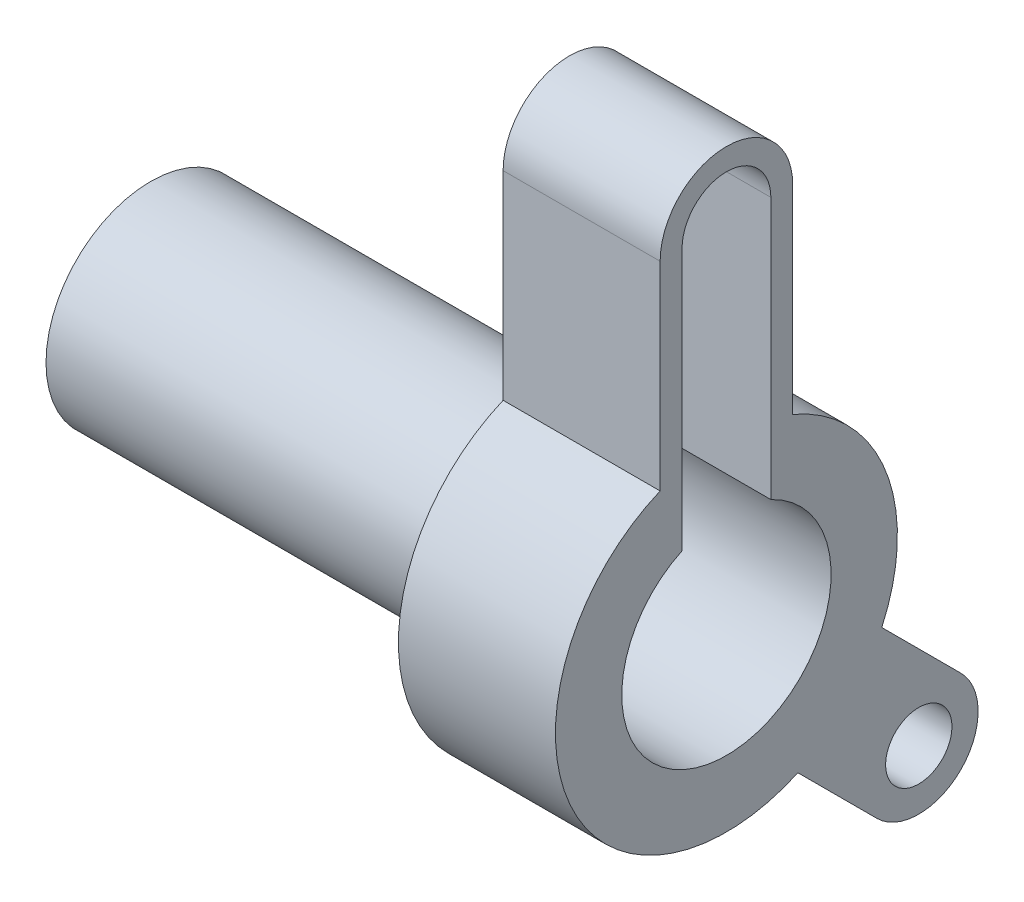
ISO-10303-21;
HEADER;
FILE_DESCRIPTION(('STEP AP214'),'2;1');
FILE_NAME('part.step','',(''),(''),'','','');
FILE_SCHEMA(('AUTOMOTIVE_DESIGN { 1 0 10303 214 1 1 1 1 }'));
ENDSEC;
DATA;
#1=APPLICATION_CONTEXT('core data for automotive mechanical design processes');
#2=APPLICATION_PROTOCOL_DEFINITION('international standard','automotive_design',2000,#1);
#3=PRODUCT_CONTEXT('',#1,'mechanical');
#4=PRODUCT('Part','Part','',(#3));
#5=PRODUCT_RELATED_PRODUCT_CATEGORY('part','',(#4));
#6=PRODUCT_DEFINITION_FORMATION('','',#4);
#7=PRODUCT_DEFINITION_CONTEXT('part definition',#1,'design');
#8=PRODUCT_DEFINITION('design','',#6,#7);
#9=PRODUCT_DEFINITION_SHAPE('','',#8);
#10=(LENGTH_UNIT() NAMED_UNIT(*) SI_UNIT(.MILLI.,.METRE.));
#11=(NAMED_UNIT(*) PLANE_ANGLE_UNIT() SI_UNIT($,.RADIAN.));
#12=(NAMED_UNIT(*) SI_UNIT($,.STERADIAN.) SOLID_ANGLE_UNIT());
#13=UNCERTAINTY_MEASURE_WITH_UNIT(LENGTH_MEASURE(1.E-05),#10,'distance_accuracy_value','');
#14=(GEOMETRIC_REPRESENTATION_CONTEXT(3) GLOBAL_UNCERTAINTY_ASSIGNED_CONTEXT((#13)) GLOBAL_UNIT_ASSIGNED_CONTEXT((#10,
#11,#12)) REPRESENTATION_CONTEXT('',''));
#15=CARTESIAN_POINT('',(0.,0.,0.));
#16=DIRECTION('',(0.,0.,1.));
#17=DIRECTION('',(1.,0.,0.));
#18=AXIS2_PLACEMENT_3D('',#15,#16,#17);
#19=CARTESIAN_POINT('',(0.,0.,0.));
#20=DIRECTION('',(-1.,0.,0.));
#21=DIRECTION('',(0.,0.,1.));
#22=AXIS2_PLACEMENT_3D('',#19,#20,#21);
#23=CYLINDRICAL_SURFACE('',#22,49.);
#24=CARTESIAN_POINT('',(120.,0.,0.));
#25=DIRECTION('',(-1.,0.,0.));
#26=DIRECTION('',(0.,0.,1.));
#27=AXIS2_PLACEMENT_3D('',#24,#25,#26);
#28=CIRCLE('',#27,49.);
#29=CARTESIAN_POINT('',(120.,-44.5169688987151,-20.4753383383727));
#30=VERTEX_POINT('',#29);
#31=CARTESIAN_POINT('',(120.,45.1663591625449,19.));
#32=VERTEX_POINT('',#31);
#33=EDGE_CURVE('E229',#30,#32,#28,.T.);
#34=ORIENTED_EDGE('',*,*,#33,.F.);
#35=DIRECTION('',(1.,0.,0.));
#36=VECTOR('',#35,1.);
#37=CARTESIAN_POINT('',(35.029416855008,-44.5169688987151,-20.4753383383727));
#38=LINE('',#37,#36);
#39=CARTESIAN_POINT('',(165.,-44.5169688987151,-20.4753383383727));
#40=VERTEX_POINT('',#39);
#41=EDGE_CURVE('E169',#30,#40,#38,.T.);
#42=ORIENTED_EDGE('',*,*,#41,.T.);
#43=CARTESIAN_POINT('',(165.,0.,0.));
#44=DIRECTION('',(-1.,0.,0.));
#45=DIRECTION('',(0.,0.,1.));
#46=AXIS2_PLACEMENT_3D('',#43,#44,#45);
#47=CIRCLE('',#46,49.);
#48=CARTESIAN_POINT('',(165.,45.1663591625449,19.));
#49=VERTEX_POINT('',#48);
#50=EDGE_CURVE('E206',#40,#49,#47,.T.);
#51=ORIENTED_EDGE('',*,*,#50,.T.);
#52=DIRECTION('',(1.,0.,0.));
#53=VECTOR('',#52,1.);
#54=CARTESIAN_POINT('',(35.029416855008,45.1663591625449,19.));
#55=LINE('',#54,#53);
#56=EDGE_CURVE('E142',#32,#49,#55,.T.);
#57=ORIENTED_EDGE('',*,*,#56,.F.);
#58=EDGE_LOOP('',(#34,#42,#51,#57));
#59=FACE_BOUND('',#58,.T.);
#60=ADVANCED_FACE('F43',(#59),#23,.T.);
#61=CARTESIAN_POINT('',(165.,45.1663591625449,-19.));
#62=VERTEX_POINT('',#61);
#63=CARTESIAN_POINT('',(165.,-20.4753383383724,-44.5169688987152));
#64=VERTEX_POINT('',#63);
#65=EDGE_CURVE('E226',#62,#64,#47,.T.);
#66=ORIENTED_EDGE('',*,*,#65,.T.);
#67=DIRECTION('',(1.,0.,0.));
#68=VECTOR('',#67,1.);
#69=CARTESIAN_POINT('',(35.029416855008,-20.4753383383724,-44.5169688987152));
#70=LINE('',#69,#68);
#71=CARTESIAN_POINT('',(120.,-20.4753383383724,-44.5169688987152));
#72=VERTEX_POINT('',#71);
#73=EDGE_CURVE('E175',#72,#64,#70,.T.);
#74=ORIENTED_EDGE('',*,*,#73,.F.);
#75=CARTESIAN_POINT('',(120.,45.1663591625449,-19.));
#76=VERTEX_POINT('',#75);
#77=EDGE_CURVE('E230',#76,#72,#28,.T.);
#78=ORIENTED_EDGE('',*,*,#77,.F.);
#79=DIRECTION('',(1.,0.,0.));
#80=VECTOR('',#79,1.);
#81=CARTESIAN_POINT('',(35.029416855008,45.1663591625449,-19.));
#82=LINE('',#81,#80);
#83=EDGE_CURVE('E158',#76,#62,#82,.T.);
#84=ORIENTED_EDGE('',*,*,#83,.T.);
#85=EDGE_LOOP('',(#66,#74,#78,#84));
#86=FACE_BOUND('',#85,.T.);
#87=ADVANCED_FACE('F256',(#86),#23,.T.);
#88=CARTESIAN_POINT('',(165.,0.,0.));
#89=DIRECTION('',(-1.,0.,0.));
#90=DIRECTION('',(0.,0.,1.));
#91=AXIS2_PLACEMENT_3D('',#88,#89,#90);
#92=PLANE('',#91);
#93=DIRECTION('',(0.,1.,0.));
#94=VECTOR('',#93,1.);
#95=CARTESIAN_POINT('',(165.,0.,19.));
#96=LINE('',#95,#94);
#97=CARTESIAN_POINT('',(165.,102.166359162545,19.));
#98=VERTEX_POINT('',#97);
#99=EDGE_CURVE('E194',#49,#98,#96,.T.);
#100=ORIENTED_EDGE('',*,*,#99,.F.);
#101=ORIENTED_EDGE('',*,*,#50,.F.);
#102=DIRECTION('',(0.,0.707106781186547,0.707106781186548));
#103=VECTOR('',#102,1.);
#104=CARTESIAN_POINT('',(165.,-12.0208152801713,12.0208152801712));
#105=LINE('',#104,#103);
#106=CARTESIAN_POINT('',(165.,-67.1443858966846,-43.1027553363422));
#107=VERTEX_POINT('',#106);
#108=EDGE_CURVE('E167',#107,#40,#105,.T.);
#109=ORIENTED_EDGE('',*,*,#108,.F.);
#110=CARTESIAN_POINT('',(165.,-55.1235706165132,-55.1235706165135));
#111=DIRECTION('',(1.,0.,0.));
#112=DIRECTION('',(0.,0.,-1.));
#113=AXIS2_PLACEMENT_3D('',#110,#111,#112);
#114=CIRCLE('',#113,17.);
#115=CARTESIAN_POINT('',(165.,-43.1027553363419,-67.1443858966848));
#116=VERTEX_POINT('',#115);
#117=EDGE_CURVE('E164',#116,#107,#114,.F.);
#118=ORIENTED_EDGE('',*,*,#117,.F.);
#119=DIRECTION('',(0.,-0.707106781186547,-0.707106781186548));
#120=VECTOR('',#119,1.);
#121=CARTESIAN_POINT('',(165.,12.0208152801714,-12.0208152801714));
#122=LINE('',#121,#120);
#123=EDGE_CURVE('E171',#64,#116,#122,.T.);
#124=ORIENTED_EDGE('',*,*,#123,.F.);
#125=ORIENTED_EDGE('',*,*,#65,.F.);
#126=DIRECTION('',(0.,-1.,0.));
#127=VECTOR('',#126,1.);
#128=CARTESIAN_POINT('',(165.,0.,-19.));
#129=LINE('',#128,#127);
#130=CARTESIAN_POINT('',(165.,102.166359162545,-19.));
#131=VERTEX_POINT('',#130);
#132=EDGE_CURVE('E202',#131,#62,#129,.T.);
#133=ORIENTED_EDGE('',*,*,#132,.F.);
#134=CARTESIAN_POINT('',(165.,102.166359162545,0.));
#135=DIRECTION('',(1.,0.,0.));
#136=DIRECTION('',(0.,0.,-1.));
#137=AXIS2_PLACEMENT_3D('',#134,#135,#136);
#138=CIRCLE('',#137,19.);
#139=EDGE_CURVE('E198',#98,#131,#138,.F.);
#140=ORIENTED_EDGE('',*,*,#139,.F.);
#141=EDGE_LOOP('',(#100,#101,#109,#118,#124,#125,#133,#140));
#142=FACE_BOUND('',#141,.T.);
#143=DIRECTION('',(0.,1.,0.));
#144=VECTOR('',#143,1.);
#145=CARTESIAN_POINT('',(165.,0.,-12.7274871774288));
#146=LINE('',#145,#144);
#147=CARTESIAN_POINT('',(165.,27.1663591625449,-12.7274871774288));
#148=VERTEX_POINT('',#147);
#149=CARTESIAN_POINT('',(165.,102.166359162545,-12.7274871774288));
#150=VERTEX_POINT('',#149);
#151=EDGE_CURVE('E153',#148,#150,#146,.T.);
#152=ORIENTED_EDGE('',*,*,#151,.F.);
#153=CARTESIAN_POINT('',(165.,0.,0.));
#154=DIRECTION('',(-1.,0.,0.));
#155=DIRECTION('',(0.,0.,1.));
#156=AXIS2_PLACEMENT_3D('',#153,#154,#155);
#157=CIRCLE('',#156,30.);
#158=CARTESIAN_POINT('',(165.,27.1663591625449,12.7274871774288));
#159=VERTEX_POINT('',#158);
#160=EDGE_CURVE('E12',#148,#159,#157,.T.);
#161=ORIENTED_EDGE('',*,*,#160,.T.);
#162=DIRECTION('',(0.,-1.,0.));
#163=VECTOR('',#162,1.);
#164=CARTESIAN_POINT('',(165.,0.,12.7274871774288));
#165=LINE('',#164,#163);
#166=CARTESIAN_POINT('',(165.,102.166359162545,12.7274871774288));
#167=VERTEX_POINT('',#166);
#168=EDGE_CURVE('E132',#167,#159,#165,.T.);
#169=ORIENTED_EDGE('',*,*,#168,.F.);
#170=CARTESIAN_POINT('',(165.,102.166359162545,0.));
#171=DIRECTION('',(1.,0.,0.));
#172=DIRECTION('',(0.,0.,-1.));
#173=AXIS2_PLACEMENT_3D('',#170,#171,#172);
#174=CIRCLE('',#173,12.7274871774288);
#175=EDGE_CURVE('E155',#150,#167,#174,.T.);
#176=ORIENTED_EDGE('',*,*,#175,.F.);
#177=EDGE_LOOP('',(#152,#161,#169,#176));
#178=FACE_BOUND('',#177,.T.);
#179=CARTESIAN_POINT('',(165.,-55.1235706165132,-55.1235706165135));
#180=DIRECTION('',(1.,0.,0.));
#181=DIRECTION('',(0.,0.,-1.));
#182=AXIS2_PLACEMENT_3D('',#179,#180,#181);
#183=CIRCLE('',#182,9.50000000000001);
#184=CARTESIAN_POINT('',(165.,-55.1235706165132,-64.6235706165135));
#185=VERTEX_POINT('',#184);
#186=EDGE_CURVE('E178',#185,#185,#183,.T.);
#187=ORIENTED_EDGE('',*,*,#186,.F.);
#188=EDGE_LOOP('',(#187));
#189=FACE_BOUND('',#188,.T.);
#190=ADVANCED_FACE('F45',(#142,#178,#189),#92,.F.);
#191=CARTESIAN_POINT('',(0.,0.,0.));
#192=DIRECTION('',(-1.,0.,0.));
#193=DIRECTION('',(0.,0.,1.));
#194=AXIS2_PLACEMENT_3D('',#191,#192,#193);
#195=CYLINDRICAL_SURFACE('',#194,30.);
#196=ORIENTED_EDGE('',*,*,#160,.F.);
#197=DIRECTION('',(1.,0.,0.));
#198=VECTOR('',#197,1.);
#199=CARTESIAN_POINT('',(0.,27.1663591625449,-12.7274871774288));
#200=LINE('',#199,#198);
#201=CARTESIAN_POINT('',(120.,27.1663591625449,-12.7274871774288));
#202=VERTEX_POINT('',#201);
#203=EDGE_CURVE('E149',#202,#148,#200,.T.);
#204=ORIENTED_EDGE('',*,*,#203,.F.);
#205=CARTESIAN_POINT('',(120.,0.,0.));
#206=DIRECTION('',(-1.,0.,0.));
#207=DIRECTION('',(0.,0.,1.));
#208=AXIS2_PLACEMENT_3D('',#205,#206,#207);
#209=CIRCLE('',#208,30.);
#210=CARTESIAN_POINT('',(120.,27.1663591625449,12.7274871774288));
#211=VERTEX_POINT('',#210);
#212=EDGE_CURVE('E51',#202,#211,#209,.T.);
#213=ORIENTED_EDGE('',*,*,#212,.T.);
#214=DIRECTION('',(1.,0.,0.));
#215=VECTOR('',#214,1.);
#216=CARTESIAN_POINT('',(0.,27.1663591625449,12.7274871774288));
#217=LINE('',#216,#215);
#218=EDGE_CURVE('E135',#211,#159,#217,.T.);
#219=ORIENTED_EDGE('',*,*,#218,.T.);
#220=EDGE_LOOP('',(#196,#204,#213,#219));
#221=FACE_BOUND('',#220,.T.);
#222=ADVANCED_FACE('F146',(#221),#195,.F.);
#223=CARTESIAN_POINT('',(120.,0.,0.));
#224=DIRECTION('',(-1.,0.,0.));
#225=DIRECTION('',(0.,0.,1.));
#226=AXIS2_PLACEMENT_3D('',#223,#224,#225);
#227=PLANE('',#226);
#228=ORIENTED_EDGE('',*,*,#212,.F.);
#229=DIRECTION('',(0.,1.,0.));
#230=VECTOR('',#229,1.);
#231=CARTESIAN_POINT('',(120.,0.,-12.7274871774288));
#232=LINE('',#231,#230);
#233=CARTESIAN_POINT('',(120.,102.166359162545,-12.7274871774288));
#234=VERTEX_POINT('',#233);
#235=EDGE_CURVE('E157',#202,#234,#232,.T.);
#236=ORIENTED_EDGE('',*,*,#235,.T.);
#237=CARTESIAN_POINT('',(120.,102.166359162545,0.));
#238=DIRECTION('',(-1.,0.,0.));
#239=DIRECTION('',(0.,0.,1.));
#240=AXIS2_PLACEMENT_3D('',#237,#238,#239);
#241=CIRCLE('',#240,12.7274871774288);
#242=CARTESIAN_POINT('',(120.,102.166359162545,12.7274871774288));
#243=VERTEX_POINT('',#242);
#244=EDGE_CURVE('E214',#234,#243,#241,.F.);
#245=ORIENTED_EDGE('',*,*,#244,.T.);
#246=DIRECTION('',(0.,-1.,0.));
#247=VECTOR('',#246,1.);
#248=CARTESIAN_POINT('',(120.,0.,12.7274871774288));
#249=LINE('',#248,#247);
#250=EDGE_CURVE('E212',#243,#211,#249,.T.);
#251=ORIENTED_EDGE('',*,*,#250,.T.);
#252=EDGE_LOOP('',(#228,#236,#245,#251));
#253=FACE_BOUND('',#252,.T.);
#254=ORIENTED_EDGE('',*,*,#77,.T.);
#255=DIRECTION('',(0.,-0.707106781186547,-0.707106781186548));
#256=VECTOR('',#255,1.);
#257=CARTESIAN_POINT('',(120.,12.0208152801714,-12.0208152801714));
#258=LINE('',#257,#256);
#259=CARTESIAN_POINT('',(120.,-43.1027553363419,-67.1443858966848));
#260=VERTEX_POINT('',#259);
#261=EDGE_CURVE('E174',#72,#260,#258,.T.);
#262=ORIENTED_EDGE('',*,*,#261,.T.);
#263=CARTESIAN_POINT('',(120.,-55.1235706165132,-55.1235706165135));
#264=DIRECTION('',(-1.,0.,0.));
#265=DIRECTION('',(0.,0.,1.));
#266=AXIS2_PLACEMENT_3D('',#263,#264,#265);
#267=CIRCLE('',#266,17.);
#268=CARTESIAN_POINT('',(120.,-67.1443858966846,-43.1027553363422));
#269=VERTEX_POINT('',#268);
#270=EDGE_CURVE('E186',#260,#269,#267,.T.);
#271=ORIENTED_EDGE('',*,*,#270,.T.);
#272=DIRECTION('',(0.,0.707106781186547,0.707106781186548));
#273=VECTOR('',#272,1.);
#274=CARTESIAN_POINT('',(120.,-12.0208152801713,12.0208152801712));
#275=LINE('',#274,#273);
#276=EDGE_CURVE('E58',#269,#30,#275,.T.);
#277=ORIENTED_EDGE('',*,*,#276,.T.);
#278=ORIENTED_EDGE('',*,*,#33,.T.);
#279=DIRECTION('',(0.,1.,0.));
#280=VECTOR('',#279,1.);
#281=CARTESIAN_POINT('',(120.,0.,19.));
#282=LINE('',#281,#280);
#283=CARTESIAN_POINT('',(120.,102.166359162545,19.));
#284=VERTEX_POINT('',#283);
#285=EDGE_CURVE('E209',#32,#284,#282,.T.);
#286=ORIENTED_EDGE('',*,*,#285,.T.);
#287=CARTESIAN_POINT('',(120.,102.166359162545,0.));
#288=DIRECTION('',(-1.,0.,0.));
#289=DIRECTION('',(0.,0.,1.));
#290=AXIS2_PLACEMENT_3D('',#287,#288,#289);
#291=CIRCLE('',#290,19.);
#292=CARTESIAN_POINT('',(120.,102.166359162545,-19.));
#293=VERTEX_POINT('',#292);
#294=EDGE_CURVE('E207',#284,#293,#291,.T.);
#295=ORIENTED_EDGE('',*,*,#294,.T.);
#296=DIRECTION('',(0.,-1.,0.));
#297=VECTOR('',#296,1.);
#298=CARTESIAN_POINT('',(120.,0.,-19.));
#299=LINE('',#298,#297);
#300=EDGE_CURVE('E65',#293,#76,#299,.T.);
#301=ORIENTED_EDGE('',*,*,#300,.T.);
#302=EDGE_LOOP('',(#254,#262,#271,#277,#278,#286,#295,#301));
#303=FACE_BOUND('',#302,.T.);
#304=CARTESIAN_POINT('',(120.,-55.1235706165132,-55.1235706165135));
#305=DIRECTION('',(-1.,0.,0.));
#306=DIRECTION('',(0.,0.,1.));
#307=AXIS2_PLACEMENT_3D('',#304,#305,#306);
#308=CIRCLE('',#307,9.50000000000001);
#309=CARTESIAN_POINT('',(120.,-55.1235706165132,-45.6235706165135));
#310=VERTEX_POINT('',#309);
#311=EDGE_CURVE('E181',#310,#310,#308,.F.);
#312=ORIENTED_EDGE('',*,*,#311,.T.);
#313=EDGE_LOOP('',(#312));
#314=FACE_BOUND('',#313,.T.);
#315=ADVANCED_FACE('F234',(#253,#303,#314),#227,.T.);
#316=CARTESIAN_POINT('',(35.029416855008,102.166359162545,0.));
#317=DIRECTION('',(1.,0.,0.));
#318=DIRECTION('',(0.,0.,-1.));
#319=AXIS2_PLACEMENT_3D('',#316,#317,#318);
#320=CYLINDRICAL_SURFACE('',#319,12.7274871774288);
#321=ORIENTED_EDGE('',*,*,#244,.F.);
#322=DIRECTION('',(1.,0.,0.));
#323=VECTOR('',#322,1.);
#324=CARTESIAN_POINT('',(35.029416855008,102.166359162545,-12.7274871774288));
#325=LINE('',#324,#323);
#326=EDGE_CURVE('E184',#234,#150,#325,.T.);
#327=ORIENTED_EDGE('',*,*,#326,.T.);
#328=ORIENTED_EDGE('',*,*,#175,.T.);
#329=DIRECTION('',(1.,0.,0.));
#330=VECTOR('',#329,1.);
#331=CARTESIAN_POINT('',(35.029416855008,102.166359162545,12.7274871774288));
#332=LINE('',#331,#330);
#333=EDGE_CURVE('E138',#243,#167,#332,.T.);
#334=ORIENTED_EDGE('',*,*,#333,.F.);
#335=EDGE_LOOP('',(#321,#327,#328,#334));
#336=FACE_BOUND('',#335,.T.);
#337=ADVANCED_FACE('F284',(#336),#320,.F.);
#338=CARTESIAN_POINT('',(35.029416855008,0.,12.7274871774288));
#339=DIRECTION('',(0.,0.,1.));
#340=DIRECTION('',(1.,0.,0.));
#341=AXIS2_PLACEMENT_3D('',#338,#339,#340);
#342=PLANE('',#341);
#343=ORIENTED_EDGE('',*,*,#250,.F.);
#344=ORIENTED_EDGE('',*,*,#333,.T.);
#345=ORIENTED_EDGE('',*,*,#168,.T.);
#346=ORIENTED_EDGE('',*,*,#218,.F.);
#347=EDGE_LOOP('',(#343,#344,#345,#346));
#348=FACE_BOUND('',#347,.T.);
#349=ADVANCED_FACE('F134',(#348),#342,.F.);
#350=CARTESIAN_POINT('',(35.029416855008,0.,19.));
#351=DIRECTION('',(0.,0.,-1.));
#352=DIRECTION('',(-1.,0.,0.));
#353=AXIS2_PLACEMENT_3D('',#350,#351,#352);
#354=PLANE('',#353);
#355=ORIENTED_EDGE('',*,*,#285,.F.);
#356=ORIENTED_EDGE('',*,*,#56,.T.);
#357=ORIENTED_EDGE('',*,*,#99,.T.);
#358=DIRECTION('',(1.,0.,0.));
#359=VECTOR('',#358,1.);
#360=CARTESIAN_POINT('',(35.029416855008,102.166359162545,19.));
#361=LINE('',#360,#359);
#362=EDGE_CURVE('E197',#284,#98,#361,.T.);
#363=ORIENTED_EDGE('',*,*,#362,.F.);
#364=EDGE_LOOP('',(#355,#356,#357,#363));
#365=FACE_BOUND('',#364,.T.);
#366=ADVANCED_FACE('F240',(#365),#354,.F.);
#367=CARTESIAN_POINT('',(35.029416855008,102.166359162545,0.));
#368=DIRECTION('',(1.,0.,0.));
#369=DIRECTION('',(0.,0.,-1.));
#370=AXIS2_PLACEMENT_3D('',#367,#368,#369);
#371=CYLINDRICAL_SURFACE('',#370,19.);
#372=ORIENTED_EDGE('',*,*,#294,.F.);
#373=ORIENTED_EDGE('',*,*,#362,.T.);
#374=ORIENTED_EDGE('',*,*,#139,.T.);
#375=DIRECTION('',(1.,0.,0.));
#376=VECTOR('',#375,1.);
#377=CARTESIAN_POINT('',(35.029416855008,102.166359162545,-19.));
#378=LINE('',#377,#376);
#379=EDGE_CURVE('E201',#293,#131,#378,.T.);
#380=ORIENTED_EDGE('',*,*,#379,.F.);
#381=EDGE_LOOP('',(#372,#373,#374,#380));
#382=FACE_BOUND('',#381,.T.);
#383=ADVANCED_FACE('F251',(#382),#371,.T.);
#384=CARTESIAN_POINT('',(35.029416855008,0.,-19.));
#385=DIRECTION('',(0.,0.,1.));
#386=DIRECTION('',(1.,0.,0.));
#387=AXIS2_PLACEMENT_3D('',#384,#385,#386);
#388=PLANE('',#387);
#389=ORIENTED_EDGE('',*,*,#300,.F.);
#390=ORIENTED_EDGE('',*,*,#379,.T.);
#391=ORIENTED_EDGE('',*,*,#132,.T.);
#392=ORIENTED_EDGE('',*,*,#83,.F.);
#393=EDGE_LOOP('',(#389,#390,#391,#392));
#394=FACE_BOUND('',#393,.T.);
#395=ADVANCED_FACE('F253',(#394),#388,.F.);
#396=CARTESIAN_POINT('',(35.029416855008,0.,-12.7274871774288));
#397=DIRECTION('',(0.,0.,-1.));
#398=DIRECTION('',(-1.,0.,0.));
#399=AXIS2_PLACEMENT_3D('',#396,#397,#398);
#400=PLANE('',#399);
#401=ORIENTED_EDGE('',*,*,#235,.F.);
#402=ORIENTED_EDGE('',*,*,#203,.T.);
#403=ORIENTED_EDGE('',*,*,#151,.T.);
#404=ORIENTED_EDGE('',*,*,#326,.F.);
#405=EDGE_LOOP('',(#401,#402,#403,#404));
#406=FACE_BOUND('',#405,.T.);
#407=ADVANCED_FACE('F160',(#406),#400,.F.);
#408=CARTESIAN_POINT('',(35.029416855008,-55.1235706165132,-55.1235706165135));
#409=DIRECTION('',(1.,0.,0.));
#410=DIRECTION('',(0.,0.,-1.));
#411=AXIS2_PLACEMENT_3D('',#408,#409,#410);
#412=CYLINDRICAL_SURFACE('',#411,17.);
#413=ORIENTED_EDGE('',*,*,#270,.F.);
#414=DIRECTION('',(1.,0.,0.));
#415=VECTOR('',#414,1.);
#416=CARTESIAN_POINT('',(35.029416855008,-43.1027553363419,-67.1443858966848));
#417=LINE('',#416,#415);
#418=EDGE_CURVE('E162',#260,#116,#417,.T.);
#419=ORIENTED_EDGE('',*,*,#418,.T.);
#420=ORIENTED_EDGE('',*,*,#117,.T.);
#421=DIRECTION('',(1.,0.,0.));
#422=VECTOR('',#421,1.);
#423=CARTESIAN_POINT('',(35.029416855008,-67.1443858966846,-43.1027553363422));
#424=LINE('',#423,#422);
#425=EDGE_CURVE('E170',#269,#107,#424,.T.);
#426=ORIENTED_EDGE('',*,*,#425,.F.);
#427=EDGE_LOOP('',(#413,#419,#420,#426));
#428=FACE_BOUND('',#427,.T.);
#429=ADVANCED_FACE('F263',(#428),#412,.T.);
#430=CARTESIAN_POINT('',(35.029416855008,-12.0208152801713,12.0208152801712));
#431=DIRECTION('',(0.,0.707106781186548,-0.707106781186546));
#432=DIRECTION('',(0.,0.707106781186547,0.707106781186548));
#433=AXIS2_PLACEMENT_3D('',#430,#431,#432);
#434=PLANE('',#433);
#435=ORIENTED_EDGE('',*,*,#276,.F.);
#436=ORIENTED_EDGE('',*,*,#425,.T.);
#437=ORIENTED_EDGE('',*,*,#108,.T.);
#438=ORIENTED_EDGE('',*,*,#41,.F.);
#439=EDGE_LOOP('',(#435,#436,#437,#438));
#440=FACE_BOUND('',#439,.T.);
#441=ADVANCED_FACE('F265',(#440),#434,.F.);
#442=CARTESIAN_POINT('',(35.029416855008,-55.1235706165132,-55.1235706165135));
#443=DIRECTION('',(1.,0.,0.));
#444=DIRECTION('',(0.,0.,-1.));
#445=AXIS2_PLACEMENT_3D('',#442,#443,#444);
#446=CYLINDRICAL_SURFACE('',#445,9.50000000000001);
#447=ORIENTED_EDGE('',*,*,#186,.T.);
#448=EDGE_LOOP('',(#447));
#449=FACE_BOUND('',#448,.T.);
#450=ORIENTED_EDGE('',*,*,#311,.F.);
#451=EDGE_LOOP('',(#450));
#452=FACE_BOUND('',#451,.T.);
#453=ADVANCED_FACE('F267',(#449,#452),#446,.F.);
#454=CARTESIAN_POINT('',(35.029416855008,12.0208152801714,-12.0208152801714));
#455=DIRECTION('',(0.,-0.707106781186548,0.707106781186547));
#456=DIRECTION('',(0.,-0.707106781186547,-0.707106781186548));
#457=AXIS2_PLACEMENT_3D('',#454,#455,#456);
#458=PLANE('',#457);
#459=ORIENTED_EDGE('',*,*,#261,.F.);
#460=ORIENTED_EDGE('',*,*,#73,.T.);
#461=ORIENTED_EDGE('',*,*,#123,.T.);
#462=ORIENTED_EDGE('',*,*,#418,.F.);
#463=EDGE_LOOP('',(#459,#460,#461,#462));
#464=FACE_BOUND('',#463,.T.);
#465=ADVANCED_FACE('F259',(#464),#458,.F.);
#466=CLOSED_SHELL('',(#60,#87,#190,#222,#315,#337,#349,#366,#383,#395,#407,#429,#441,#453,#465));
#467=MANIFOLD_SOLID_BREP('B2',#466);
#468=CARTESIAN_POINT('',(120.,0.,0.));
#469=DIRECTION('',(-1.,0.,0.));
#470=DIRECTION('',(0.,0.,1.));
#471=AXIS2_PLACEMENT_3D('',#468,#469,#470);
#472=PLANE('',#471);
#473=CARTESIAN_POINT('',(120.,0.,0.));
#474=DIRECTION('',(-1.,0.,0.));
#475=DIRECTION('',(0.,0.,1.));
#476=AXIS2_PLACEMENT_3D('',#473,#474,#475);
#477=CIRCLE('',#476,30.);
#478=CARTESIAN_POINT('',(120.,0.,30.));
#479=VERTEX_POINT('',#478);
#480=EDGE_CURVE('E427',#479,#479,#477,.T.);
#481=ORIENTED_EDGE('',*,*,#480,.F.);
#482=EDGE_LOOP('',(#481));
#483=FACE_BOUND('',#482,.T.);
#484=CARTESIAN_POINT('',(120.,0.,0.));
#485=DIRECTION('',(-1.,0.,0.));
#486=DIRECTION('',(0.,0.,1.));
#487=AXIS2_PLACEMENT_3D('',#484,#485,#486);
#488=CIRCLE('',#487,9.99999999999999);
#489=CARTESIAN_POINT('',(120.,0.,9.99999999999999));
#490=VERTEX_POINT('',#489);
#491=EDGE_CURVE('E42',#490,#490,#488,.T.);
#492=ORIENTED_EDGE('',*,*,#491,.T.);
#493=EDGE_LOOP('',(#492));
#494=FACE_BOUND('',#493,.T.);
#495=ADVANCED_FACE('F413',(#483,#494),#472,.F.);
#496=CARTESIAN_POINT('',(0.,0.,0.));
#497=DIRECTION('',(-1.,0.,0.));
#498=DIRECTION('',(0.,0.,1.));
#499=AXIS2_PLACEMENT_3D('',#496,#497,#498);
#500=CYLINDRICAL_SURFACE('',#499,9.99999999999999);
#501=CARTESIAN_POINT('',(0.,0.,0.));
#502=DIRECTION('',(-1.,0.,0.));
#503=DIRECTION('',(0.,0.,1.));
#504=AXIS2_PLACEMENT_3D('',#501,#502,#503);
#505=CIRCLE('',#504,9.99999999999999);
#506=CARTESIAN_POINT('',(0.,0.,9.99999999999999));
#507=VERTEX_POINT('',#506);
#508=EDGE_CURVE('E419',#507,#507,#505,.T.);
#509=ORIENTED_EDGE('',*,*,#508,.T.);
#510=EDGE_LOOP('',(#509));
#511=FACE_BOUND('',#510,.T.);
#512=ORIENTED_EDGE('',*,*,#491,.F.);
#513=EDGE_LOOP('',(#512));
#514=FACE_BOUND('',#513,.T.);
#515=ADVANCED_FACE('F437',(#511,#514),#500,.F.);
#516=CARTESIAN_POINT('',(0.,0.,0.));
#517=DIRECTION('',(-1.,0.,0.));
#518=DIRECTION('',(0.,0.,1.));
#519=AXIS2_PLACEMENT_3D('',#516,#517,#518);
#520=PLANE('',#519);
#521=CARTESIAN_POINT('',(0.,0.,0.));
#522=DIRECTION('',(-1.,0.,0.));
#523=DIRECTION('',(0.,0.,1.));
#524=AXIS2_PLACEMENT_3D('',#521,#522,#523);
#525=CIRCLE('',#524,30.);
#526=CARTESIAN_POINT('',(0.,0.,30.));
#527=VERTEX_POINT('',#526);
#528=EDGE_CURVE('E423',#527,#527,#525,.T.);
#529=ORIENTED_EDGE('',*,*,#528,.T.);
#530=EDGE_LOOP('',(#529));
#531=FACE_BOUND('',#530,.T.);
#532=ORIENTED_EDGE('',*,*,#508,.F.);
#533=EDGE_LOOP('',(#532));
#534=FACE_BOUND('',#533,.T.);
#535=ADVANCED_FACE('F441',(#531,#534),#520,.T.);
#536=CARTESIAN_POINT('',(0.,0.,0.));
#537=DIRECTION('',(-1.,0.,0.));
#538=DIRECTION('',(0.,0.,1.));
#539=AXIS2_PLACEMENT_3D('',#536,#537,#538);
#540=CYLINDRICAL_SURFACE('',#539,30.);
#541=ORIENTED_EDGE('',*,*,#480,.T.);
#542=EDGE_LOOP('',(#541));
#543=FACE_BOUND('',#542,.T.);
#544=ORIENTED_EDGE('',*,*,#528,.F.);
#545=EDGE_LOOP('',(#544));
#546=FACE_BOUND('',#545,.T.);
#547=ADVANCED_FACE('F433',(#543,#546),#540,.T.);
#548=CLOSED_SHELL('',(#495,#515,#535,#547));
#549=MANIFOLD_SOLID_BREP('B6',#548);
#550=ADVANCED_BREP_SHAPE_REPRESENTATION('',(#18,#467,#549),#14);
#551=SHAPE_DEFINITION_REPRESENTATION(#9,#550);
ENDSEC;
END-ISO-10303-21;
